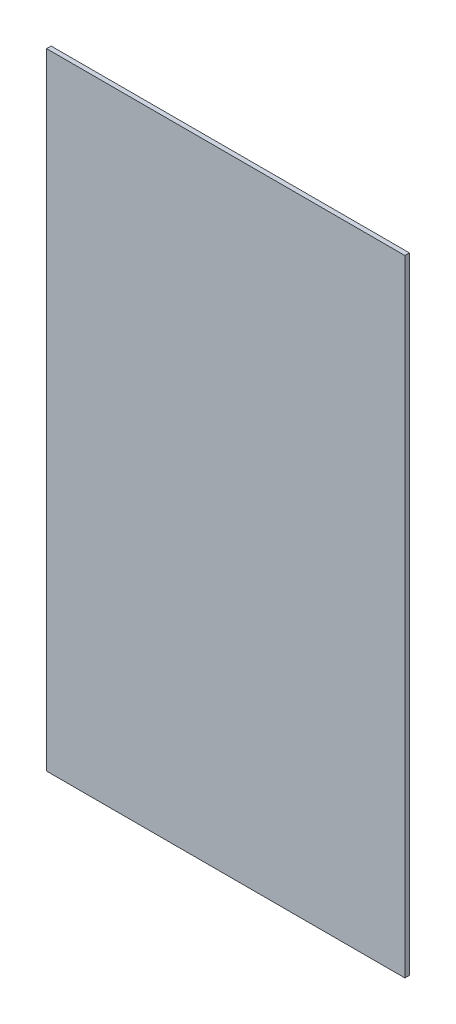
ISO-10303-21;
HEADER;
FILE_DESCRIPTION(('STEP AP214'),'2;1');
FILE_NAME('part.step','',(''),(''),'','','');
FILE_SCHEMA(('AUTOMOTIVE_DESIGN { 1 0 10303 214 1 1 1 1 }'));
ENDSEC;
DATA;
#1=APPLICATION_CONTEXT('core data for automotive mechanical design processes');
#2=APPLICATION_PROTOCOL_DEFINITION('international standard','automotive_design',2000,#1);
#3=PRODUCT_CONTEXT('',#1,'mechanical');
#4=PRODUCT('Part','Part','',(#3));
#5=PRODUCT_RELATED_PRODUCT_CATEGORY('part','',(#4));
#6=PRODUCT_DEFINITION_FORMATION('','',#4);
#7=PRODUCT_DEFINITION_CONTEXT('part definition',#1,'design');
#8=PRODUCT_DEFINITION('design','',#6,#7);
#9=PRODUCT_DEFINITION_SHAPE('','',#8);
#10=(LENGTH_UNIT() NAMED_UNIT(*) SI_UNIT(.MILLI.,.METRE.));
#11=(NAMED_UNIT(*) PLANE_ANGLE_UNIT() SI_UNIT($,.RADIAN.));
#12=(NAMED_UNIT(*) SI_UNIT($,.STERADIAN.) SOLID_ANGLE_UNIT());
#13=UNCERTAINTY_MEASURE_WITH_UNIT(LENGTH_MEASURE(1.E-05),#10,'distance_accuracy_value','');
#14=(GEOMETRIC_REPRESENTATION_CONTEXT(3) GLOBAL_UNCERTAINTY_ASSIGNED_CONTEXT((#13)) GLOBAL_UNIT_ASSIGNED_CONTEXT((#10,
#11,#12)) REPRESENTATION_CONTEXT('',''));
#15=CARTESIAN_POINT('',(0.,0.,0.));
#16=DIRECTION('',(0.,0.,1.));
#17=DIRECTION('',(1.,0.,0.));
#18=AXIS2_PLACEMENT_3D('',#15,#16,#17);
#19=CARTESIAN_POINT('',(-30.526246776655,77.2604285344074,0.8));
#20=DIRECTION('',(1.,0.,0.));
#21=DIRECTION('',(0.,1.,0.));
#22=AXIS2_PLACEMENT_3D('',#19,#20,#21);
#23=PLANE('',#22);
#24=DIRECTION('',(0.,-1.,0.));
#25=VECTOR('',#24,1.);
#26=CARTESIAN_POINT('',(-30.526246776655,77.2604285344074,0.));
#27=LINE('',#26,#25);
#28=CARTESIAN_POINT('',(-30.526246776655,77.2604285344074,0.));
#29=VERTEX_POINT('',#28);
#30=CARTESIAN_POINT('',(-30.526246776655,-32.7395714655926,0.));
#31=VERTEX_POINT('',#30);
#32=EDGE_CURVE('E96',#29,#31,#27,.T.);
#33=ORIENTED_EDGE('',*,*,#32,.T.);
#34=DIRECTION('',(0.,0.,-1.));
#35=VECTOR('',#34,1.);
#36=CARTESIAN_POINT('',(-30.526246776655,-32.7395714655926,0.8));
#37=LINE('',#36,#35);
#38=CARTESIAN_POINT('',(-30.526246776655,-32.7395714655926,0.8));
#39=VERTEX_POINT('',#38);
#40=EDGE_CURVE('E11',#39,#31,#37,.T.);
#41=ORIENTED_EDGE('',*,*,#40,.F.);
#42=DIRECTION('',(0.,-1.,0.));
#43=VECTOR('',#42,1.);
#44=CARTESIAN_POINT('',(-30.526246776655,77.2604285344074,0.8));
#45=LINE('',#44,#43);
#46=CARTESIAN_POINT('',(-30.526246776655,77.2604285344074,0.8));
#47=VERTEX_POINT('',#46);
#48=EDGE_CURVE('E84',#47,#39,#45,.T.);
#49=ORIENTED_EDGE('',*,*,#48,.F.);
#50=DIRECTION('',(0.,0.,-1.));
#51=VECTOR('',#50,1.);
#52=CARTESIAN_POINT('',(-30.526246776655,77.2604285344074,0.8));
#53=LINE('',#52,#51);
#54=EDGE_CURVE('E92',#47,#29,#53,.T.);
#55=ORIENTED_EDGE('',*,*,#54,.T.);
#56=EDGE_LOOP('',(#33,#41,#49,#55));
#57=FACE_BOUND('',#56,.T.);
#58=ADVANCED_FACE('F33',(#57),#23,.F.);
#59=CARTESIAN_POINT('',(-30.526246776655,-32.7395714655926,0.8));
#60=DIRECTION('',(0.,1.,0.));
#61=DIRECTION('',(0.,0.,1.));
#62=AXIS2_PLACEMENT_3D('',#59,#60,#61);
#63=PLANE('',#62);
#64=DIRECTION('',(1.,0.,0.));
#65=VECTOR('',#64,1.);
#66=CARTESIAN_POINT('',(-30.526246776655,-32.7395714655926,0.));
#67=LINE('',#66,#65);
#68=CARTESIAN_POINT('',(32.473753223345,-32.7395714655926,0.));
#69=VERTEX_POINT('',#68);
#70=EDGE_CURVE('E88',#31,#69,#67,.T.);
#71=ORIENTED_EDGE('',*,*,#70,.T.);
#72=DIRECTION('',(0.,0.,-1.));
#73=VECTOR('',#72,1.);
#74=CARTESIAN_POINT('',(32.473753223345,-32.7395714655926,0.8));
#75=LINE('',#74,#73);
#76=CARTESIAN_POINT('',(32.473753223345,-32.7395714655926,0.8));
#77=VERTEX_POINT('',#76);
#78=EDGE_CURVE('E41',#77,#69,#75,.T.);
#79=ORIENTED_EDGE('',*,*,#78,.F.);
#80=DIRECTION('',(1.,0.,0.));
#81=VECTOR('',#80,1.);
#82=CARTESIAN_POINT('',(-30.526246776655,-32.7395714655926,0.8));
#83=LINE('',#82,#81);
#84=EDGE_CURVE('E79',#39,#77,#83,.T.);
#85=ORIENTED_EDGE('',*,*,#84,.F.);
#86=ORIENTED_EDGE('',*,*,#40,.T.);
#87=EDGE_LOOP('',(#71,#79,#85,#86));
#88=FACE_BOUND('',#87,.T.);
#89=ADVANCED_FACE('F87',(#88),#63,.F.);
#90=CARTESIAN_POINT('',(32.473753223345,77.2604285344074,0.8));
#91=DIRECTION('',(-1.,0.,0.));
#92=DIRECTION('',(0.,-1.,0.));
#93=AXIS2_PLACEMENT_3D('',#90,#91,#92);
#94=PLANE('',#93);
#95=DIRECTION('',(0.,1.,0.));
#96=VECTOR('',#95,1.);
#97=CARTESIAN_POINT('',(32.473753223345,77.2604285344074,0.));
#98=LINE('',#97,#96);
#99=CARTESIAN_POINT('',(32.473753223345,77.2604285344074,0.));
#100=VERTEX_POINT('',#99);
#101=EDGE_CURVE('E66',#69,#100,#98,.T.);
#102=ORIENTED_EDGE('',*,*,#101,.T.);
#103=DIRECTION('',(0.,0.,-1.));
#104=VECTOR('',#103,1.);
#105=CARTESIAN_POINT('',(32.473753223345,77.2604285344074,0.8));
#106=LINE('',#105,#104);
#107=CARTESIAN_POINT('',(32.473753223345,77.2604285344074,0.8));
#108=VERTEX_POINT('',#107);
#109=EDGE_CURVE('E89',#108,#100,#106,.T.);
#110=ORIENTED_EDGE('',*,*,#109,.F.);
#111=DIRECTION('',(0.,1.,0.));
#112=VECTOR('',#111,1.);
#113=CARTESIAN_POINT('',(32.473753223345,77.2604285344074,0.8));
#114=LINE('',#113,#112);
#115=EDGE_CURVE('E82',#77,#108,#114,.T.);
#116=ORIENTED_EDGE('',*,*,#115,.F.);
#117=ORIENTED_EDGE('',*,*,#78,.T.);
#118=EDGE_LOOP('',(#102,#110,#116,#117));
#119=FACE_BOUND('',#118,.T.);
#120=ADVANCED_FACE('F90',(#119),#94,.F.);
#121=CARTESIAN_POINT('',(-30.526246776655,77.2604285344074,0.8));
#122=DIRECTION('',(0.,-1.,0.));
#123=DIRECTION('',(0.,0.,-1.));
#124=AXIS2_PLACEMENT_3D('',#121,#122,#123);
#125=PLANE('',#124);
#126=DIRECTION('',(-1.,0.,0.));
#127=VECTOR('',#126,1.);
#128=CARTESIAN_POINT('',(-30.526246776655,77.2604285344074,0.));
#129=LINE('',#128,#127);
#130=EDGE_CURVE('E72',#100,#29,#129,.T.);
#131=ORIENTED_EDGE('',*,*,#130,.T.);
#132=ORIENTED_EDGE('',*,*,#54,.F.);
#133=DIRECTION('',(-1.,0.,0.));
#134=VECTOR('',#133,1.);
#135=CARTESIAN_POINT('',(-30.526246776655,77.2604285344074,0.8));
#136=LINE('',#135,#134);
#137=EDGE_CURVE('E49',#108,#47,#136,.T.);
#138=ORIENTED_EDGE('',*,*,#137,.F.);
#139=ORIENTED_EDGE('',*,*,#109,.T.);
#140=EDGE_LOOP('',(#131,#132,#138,#139));
#141=FACE_BOUND('',#140,.T.);
#142=ADVANCED_FACE('F103',(#141),#125,.F.);
#143=CARTESIAN_POINT('',(0.,0.,0.8));
#144=DIRECTION('',(0.,0.,1.));
#145=DIRECTION('',(1.,0.,0.));
#146=AXIS2_PLACEMENT_3D('',#143,#144,#145);
#147=PLANE('',#146);
#148=ORIENTED_EDGE('',*,*,#48,.T.);
#149=ORIENTED_EDGE('',*,*,#84,.T.);
#150=ORIENTED_EDGE('',*,*,#115,.T.);
#151=ORIENTED_EDGE('',*,*,#137,.T.);
#152=EDGE_LOOP('',(#148,#149,#150,#151));
#153=FACE_BOUND('',#152,.T.);
#154=ADVANCED_FACE('F80',(#153),#147,.T.);
#155=CARTESIAN_POINT('',(0.,0.,0.));
#156=DIRECTION('',(0.,0.,1.));
#157=DIRECTION('',(1.,0.,0.));
#158=AXIS2_PLACEMENT_3D('',#155,#156,#157);
#159=PLANE('',#158);
#160=ORIENTED_EDGE('',*,*,#32,.F.);
#161=ORIENTED_EDGE('',*,*,#130,.F.);
#162=ORIENTED_EDGE('',*,*,#101,.F.);
#163=ORIENTED_EDGE('',*,*,#70,.F.);
#164=EDGE_LOOP('',(#160,#161,#162,#163));
#165=FACE_BOUND('',#164,.T.);
#166=ADVANCED_FACE('F106',(#165),#159,.F.);
#167=CLOSED_SHELL('',(#58,#89,#120,#142,#154,#166));
#168=MANIFOLD_SOLID_BREP('B2',#167);
#169=ADVANCED_BREP_SHAPE_REPRESENTATION('',(#18,#168),#14);
#170=SHAPE_DEFINITION_REPRESENTATION(#9,#169);
ENDSEC;
END-ISO-10303-21;
